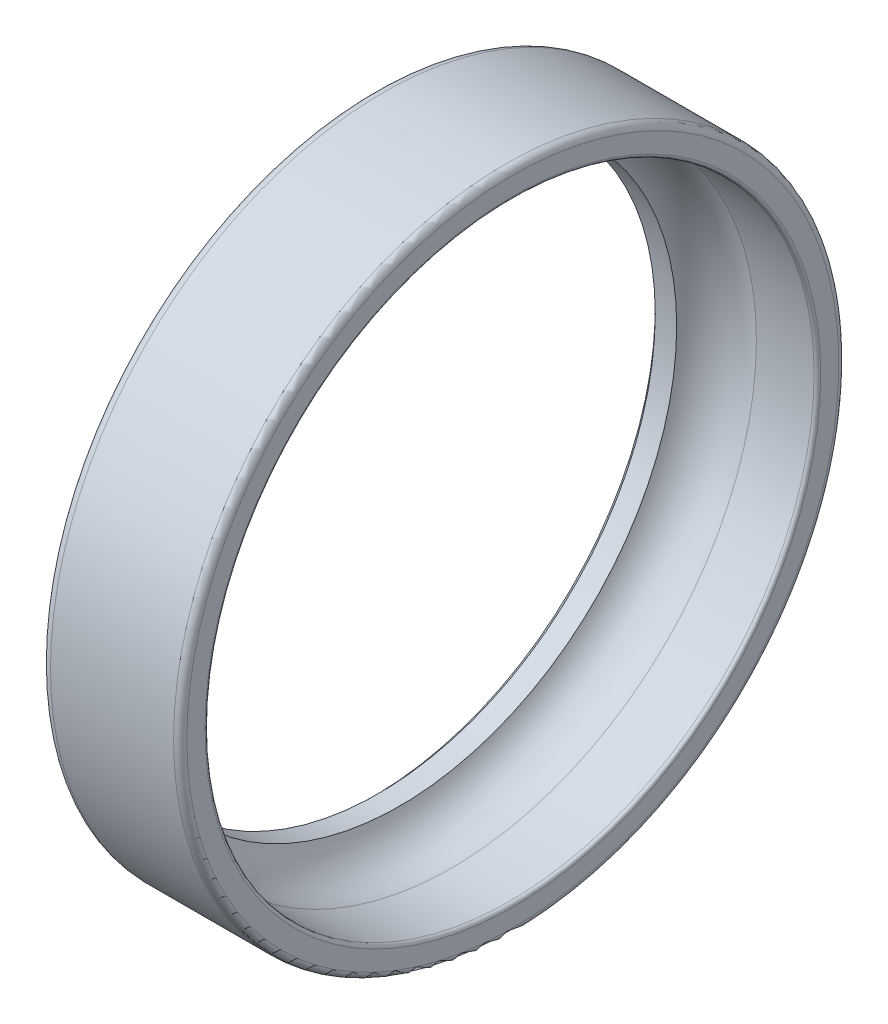
ISO-10303-21;
HEADER;
FILE_DESCRIPTION(('STEP AP214'),'2;1');
FILE_NAME('part.step','',(''),(''),'','','');
FILE_SCHEMA(('AUTOMOTIVE_DESIGN { 1 0 10303 214 1 1 1 1 }'));
ENDSEC;
DATA;
#1=APPLICATION_CONTEXT('core data for automotive mechanical design processes');
#2=APPLICATION_PROTOCOL_DEFINITION('international standard','automotive_design',2000,#1);
#3=PRODUCT_CONTEXT('',#1,'mechanical');
#4=PRODUCT('Part','Part','',(#3));
#5=PRODUCT_RELATED_PRODUCT_CATEGORY('part','',(#4));
#6=PRODUCT_DEFINITION_FORMATION('','',#4);
#7=PRODUCT_DEFINITION_CONTEXT('part definition',#1,'design');
#8=PRODUCT_DEFINITION('design','',#6,#7);
#9=PRODUCT_DEFINITION_SHAPE('','',#8);
#10=(LENGTH_UNIT() NAMED_UNIT(*) SI_UNIT(.MILLI.,.METRE.));
#11=(NAMED_UNIT(*) PLANE_ANGLE_UNIT() SI_UNIT($,.RADIAN.));
#12=(NAMED_UNIT(*) SI_UNIT($,.STERADIAN.) SOLID_ANGLE_UNIT());
#13=UNCERTAINTY_MEASURE_WITH_UNIT(LENGTH_MEASURE(1.E-05),#10,'distance_accuracy_value','');
#14=(GEOMETRIC_REPRESENTATION_CONTEXT(3) GLOBAL_UNCERTAINTY_ASSIGNED_CONTEXT((#13)) GLOBAL_UNIT_ASSIGNED_CONTEXT((#10,
#11,#12)) REPRESENTATION_CONTEXT('',''));
#15=CARTESIAN_POINT('',(0.,0.,0.));
#16=DIRECTION('',(0.,0.,1.));
#17=DIRECTION('',(1.,0.,0.));
#18=AXIS2_PLACEMENT_3D('',#15,#16,#17);
#19=CARTESIAN_POINT('',(0.,-49.0374013339471,-48.5));
#20=DIRECTION('',(-1.,0.,0.));
#21=DIRECTION('',(0.,0.,1.));
#22=AXIS2_PLACEMENT_3D('',#19,#20,#21);
#23=PLANE('',#22);
#24=CARTESIAN_POINT('',(0.,0.,0.));
#25=DIRECTION('',(-1.,0.,0.));
#26=DIRECTION('',(0.,0.,-1.));
#27=AXIS2_PLACEMENT_3D('',#24,#25,#26);
#28=CIRCLE('',#27,48.5);
#29=CARTESIAN_POINT('',(0.,0.,-48.5));
#30=VERTEX_POINT('',#29);
#31=EDGE_CURVE('E50',#30,#30,#28,.F.);
#32=ORIENTED_EDGE('',*,*,#31,.F.);
#33=EDGE_LOOP('',(#32));
#34=FACE_BOUND('',#33,.T.);
#35=CARTESIAN_POINT('',(0.,0.,0.));
#36=DIRECTION('',(1.,0.,0.));
#37=DIRECTION('',(0.,0.,1.));
#38=AXIS2_PLACEMENT_3D('',#35,#36,#37);
#39=CIRCLE('',#38,42.4);
#40=CARTESIAN_POINT('',(0.,0.,42.4));
#41=VERTEX_POINT('',#40);
#42=EDGE_CURVE('E47',#41,#41,#39,.T.);
#43=ORIENTED_EDGE('',*,*,#42,.T.);
#44=EDGE_LOOP('',(#43));
#45=FACE_BOUND('',#44,.T.);
#46=ADVANCED_FACE('F15',(#34,#45),#23,.T.);
#47=CARTESIAN_POINT('',(21.,-49.5429414750255,49.));
#48=DIRECTION('',(1.,0.,0.));
#49=DIRECTION('',(0.,0.,-1.));
#50=AXIS2_PLACEMENT_3D('',#47,#48,#49);
#51=PLANE('',#50);
#52=CARTESIAN_POINT('',(21.,0.,0.));
#53=DIRECTION('',(1.,0.,0.));
#54=DIRECTION('',(0.,-1.16843866101831E-09,1.));
#55=AXIS2_PLACEMENT_3D('',#52,#53,#54);
#56=CIRCLE('',#55,49.000000158403);
#57=CARTESIAN_POINT('',(21.,-5.72534945749815E-08,49.000000158403));
#58=VERTEX_POINT('',#57);
#59=EDGE_CURVE('E44',#58,#58,#56,.T.);
#60=ORIENTED_EDGE('',*,*,#59,.T.);
#61=EDGE_LOOP('',(#60));
#62=FACE_BOUND('',#61,.T.);
#63=CARTESIAN_POINT('',(21.,0.,0.));
#64=DIRECTION('',(-1.,0.,0.));
#65=DIRECTION('',(0.,0.,-1.));
#66=AXIS2_PLACEMENT_3D('',#63,#64,#65);
#67=CIRCLE('',#66,46.2700001662674);
#68=CARTESIAN_POINT('',(21.,0.,-46.2700001662674));
#69=VERTEX_POINT('',#68);
#70=EDGE_CURVE('E41',#69,#69,#67,.F.);
#71=ORIENTED_EDGE('',*,*,#70,.F.);
#72=EDGE_LOOP('',(#71));
#73=FACE_BOUND('',#72,.T.);
#74=ADVANCED_FACE('F58',(#62,#73),#51,.T.);
#75=CARTESIAN_POINT('',(0.,0.,0.));
#76=DIRECTION('',(-1.,0.,0.));
#77=DIRECTION('',(0.,0.,-1.));
#78=AXIS2_PLACEMENT_3D('',#75,#76,#77);
#79=CONICAL_SURFACE('',#78,42.4,0.785398163397445);
#80=ORIENTED_EDGE('',*,*,#42,.F.);
#81=EDGE_LOOP('',(#80));
#82=FACE_BOUND('',#81,.T.);
#83=CARTESIAN_POINT('',(0.75,0.,0.));
#84=DIRECTION('',(1.,0.,0.));
#85=DIRECTION('',(0.,0.,1.));
#86=AXIS2_PLACEMENT_3D('',#83,#84,#85);
#87=CIRCLE('',#86,41.65);
#88=CARTESIAN_POINT('',(0.75,0.,41.65));
#89=VERTEX_POINT('',#88);
#90=EDGE_CURVE('E38',#89,#89,#87,.T.);
#91=ORIENTED_EDGE('',*,*,#90,.T.);
#92=EDGE_LOOP('',(#91));
#93=FACE_BOUND('',#92,.T.);
#94=ADVANCED_FACE('F62',(#82,#93),#79,.F.);
#95=CARTESIAN_POINT('',(21.,0.,0.));
#96=DIRECTION('',(1.,0.,0.));
#97=DIRECTION('',(0.,0.,1.));
#98=AXIS2_PLACEMENT_3D('',#95,#96,#97);
#99=CYLINDRICAL_SURFACE('',#98,41.65);
#100=CARTESIAN_POINT('',(3.9710846230021,0.,0.));
#101=DIRECTION('',(1.,0.,0.));
#102=DIRECTION('',(0.,0.,1.));
#103=AXIS2_PLACEMENT_3D('',#100,#101,#102);
#104=CIRCLE('',#103,41.65);
#105=CARTESIAN_POINT('',(3.9710846230021,0.,41.65));
#106=VERTEX_POINT('',#105);
#107=EDGE_CURVE('E35',#106,#106,#104,.T.);
#108=ORIENTED_EDGE('',*,*,#107,.T.);
#109=EDGE_LOOP('',(#108));
#110=FACE_BOUND('',#109,.T.);
#111=ORIENTED_EDGE('',*,*,#90,.F.);
#112=EDGE_LOOP('',(#111));
#113=FACE_BOUND('',#112,.T.);
#114=ADVANCED_FACE('F65',(#110,#113),#99,.F.);
#115=CARTESIAN_POINT('',(10.5000000000009,0.,0.));
#116=DIRECTION('',(1.,0.,0.));
#117=DIRECTION('',(0.,0.,1.));
#118=AXIS2_PLACEMENT_3D('',#115,#116,#117);
#119=TOROIDAL_SURFACE('',#118,38.7499999999984,7.14400000000145);
#120=ORIENTED_EDGE('',*,*,#107,.F.);
#121=EDGE_LOOP('',(#120));
#122=FACE_BOUND('',#121,.T.);
#123=CARTESIAN_POINT('',(11.825268274728,0.,0.));
#124=DIRECTION('',(1.,0.,0.));
#125=DIRECTION('',(0.,-1.92334248187567E-10,1.));
#126=AXIS2_PLACEMENT_3D('',#123,#124,#125);
#127=CIRCLE('',#126,45.77);
#128=CARTESIAN_POINT('',(11.825268274728,-8.80313853954496E-09,45.77));
#129=VERTEX_POINT('',#128);
#130=EDGE_CURVE('E30',#129,#129,#127,.T.);
#131=ORIENTED_EDGE('',*,*,#130,.T.);
#132=EDGE_LOOP('',(#131));
#133=FACE_BOUND('',#132,.T.);
#134=ADVANCED_FACE('F70',(#122,#133),#119,.F.);
#135=CARTESIAN_POINT('',(21.,0.,0.));
#136=DIRECTION('',(1.,0.,0.));
#137=DIRECTION('',(0.,0.,1.));
#138=AXIS2_PLACEMENT_3D('',#135,#136,#137);
#139=CYLINDRICAL_SURFACE('',#138,45.77);
#140=CARTESIAN_POINT('',(20.5,0.,0.));
#141=DIRECTION('',(1.,0.,0.));
#142=DIRECTION('',(0.,0.,1.));
#143=AXIS2_PLACEMENT_3D('',#140,#141,#142);
#144=CIRCLE('',#143,45.77);
#145=CARTESIAN_POINT('',(20.5,0.,45.77));
#146=VERTEX_POINT('',#145);
#147=EDGE_CURVE('E26',#146,#146,#144,.T.);
#148=ORIENTED_EDGE('',*,*,#147,.T.);
#149=EDGE_LOOP('',(#148));
#150=FACE_BOUND('',#149,.T.);
#151=ORIENTED_EDGE('',*,*,#130,.F.);
#152=EDGE_LOOP('',(#151));
#153=FACE_BOUND('',#152,.T.);
#154=ADVANCED_FACE('F77',(#150,#153),#139,.F.);
#155=CARTESIAN_POINT('',(20.4999999999991,0.,0.));
#156=DIRECTION('',(1.,0.,0.));
#157=DIRECTION('',(0.,0.,1.));
#158=AXIS2_PLACEMENT_3D('',#155,#156,#157);
#159=TOROIDAL_SURFACE('',#158,46.2700000000009,0.50000000000093);
#160=ORIENTED_EDGE('',*,*,#70,.T.);
#161=EDGE_LOOP('',(#160));
#162=FACE_BOUND('',#161,.T.);
#163=ORIENTED_EDGE('',*,*,#147,.F.);
#164=EDGE_LOOP('',(#163));
#165=FACE_BOUND('',#164,.T.);
#166=ADVANCED_FACE('F84',(#162,#165),#159,.T.);
#167=CARTESIAN_POINT('',(20.0000000000016,0.,0.));
#168=DIRECTION('',(1.,0.,0.));
#169=DIRECTION('',(0.,0.,1.));
#170=AXIS2_PLACEMENT_3D('',#167,#168,#169);
#171=TOROIDAL_SURFACE('',#170,49.0000000000015,0.99999999999846);
#172=CARTESIAN_POINT('',(20.0000000000016,0.,0.));
#173=DIRECTION('',(1.,0.,0.));
#174=DIRECTION('',(0.,0.,1.));
#175=AXIS2_PLACEMENT_3D('',#172,#173,#174);
#176=CIRCLE('',#175,50.);
#177=CARTESIAN_POINT('',(20.0000000000016,0.,50.));
#178=VERTEX_POINT('',#177);
#179=EDGE_CURVE('E22',#178,#178,#176,.T.);
#180=ORIENTED_EDGE('',*,*,#179,.T.);
#181=EDGE_LOOP('',(#180));
#182=FACE_BOUND('',#181,.T.);
#183=ORIENTED_EDGE('',*,*,#59,.F.);
#184=EDGE_LOOP('',(#183));
#185=FACE_BOUND('',#184,.T.);
#186=ADVANCED_FACE('F88',(#182,#185),#171,.T.);
#187=CARTESIAN_POINT('',(21.,0.,0.));
#188=DIRECTION('',(1.,0.,0.));
#189=DIRECTION('',(0.,0.,1.));
#190=AXIS2_PLACEMENT_3D('',#187,#188,#189);
#191=CYLINDRICAL_SURFACE('',#190,50.);
#192=CARTESIAN_POINT('',(1.5,0.,0.));
#193=DIRECTION('',(1.,0.,0.));
#194=DIRECTION('',(0.,0.,1.));
#195=AXIS2_PLACEMENT_3D('',#192,#193,#194);
#196=CIRCLE('',#195,50.);
#197=CARTESIAN_POINT('',(1.5,0.,50.));
#198=VERTEX_POINT('',#197);
#199=EDGE_CURVE('E10',#198,#198,#196,.T.);
#200=ORIENTED_EDGE('',*,*,#199,.T.);
#201=EDGE_LOOP('',(#200));
#202=FACE_BOUND('',#201,.T.);
#203=ORIENTED_EDGE('',*,*,#179,.F.);
#204=EDGE_LOOP('',(#203));
#205=FACE_BOUND('',#204,.T.);
#206=ADVANCED_FACE('F91',(#202,#205),#191,.T.);
#207=CARTESIAN_POINT('',(1.4999999999997,0.,0.));
#208=DIRECTION('',(1.,0.,0.));
#209=DIRECTION('',(0.,0.,1.));
#210=AXIS2_PLACEMENT_3D('',#207,#208,#209);
#211=TOROIDAL_SURFACE('',#210,48.5,1.4999999999997);
#212=ORIENTED_EDGE('',*,*,#31,.T.);
#213=EDGE_LOOP('',(#212));
#214=FACE_BOUND('',#213,.T.);
#215=ORIENTED_EDGE('',*,*,#199,.F.);
#216=EDGE_LOOP('',(#215));
#217=FACE_BOUND('',#216,.T.);
#218=ADVANCED_FACE('F17',(#214,#217),#211,.T.);
#219=CLOSED_SHELL('',(#46,#74,#94,#114,#134,#154,#166,#186,#206,#218));
#220=MANIFOLD_SOLID_BREP('B1',#219);
#221=ADVANCED_BREP_SHAPE_REPRESENTATION('',(#18,#220),#14);
#222=SHAPE_DEFINITION_REPRESENTATION(#9,#221);
ENDSEC;
END-ISO-10303-21;
